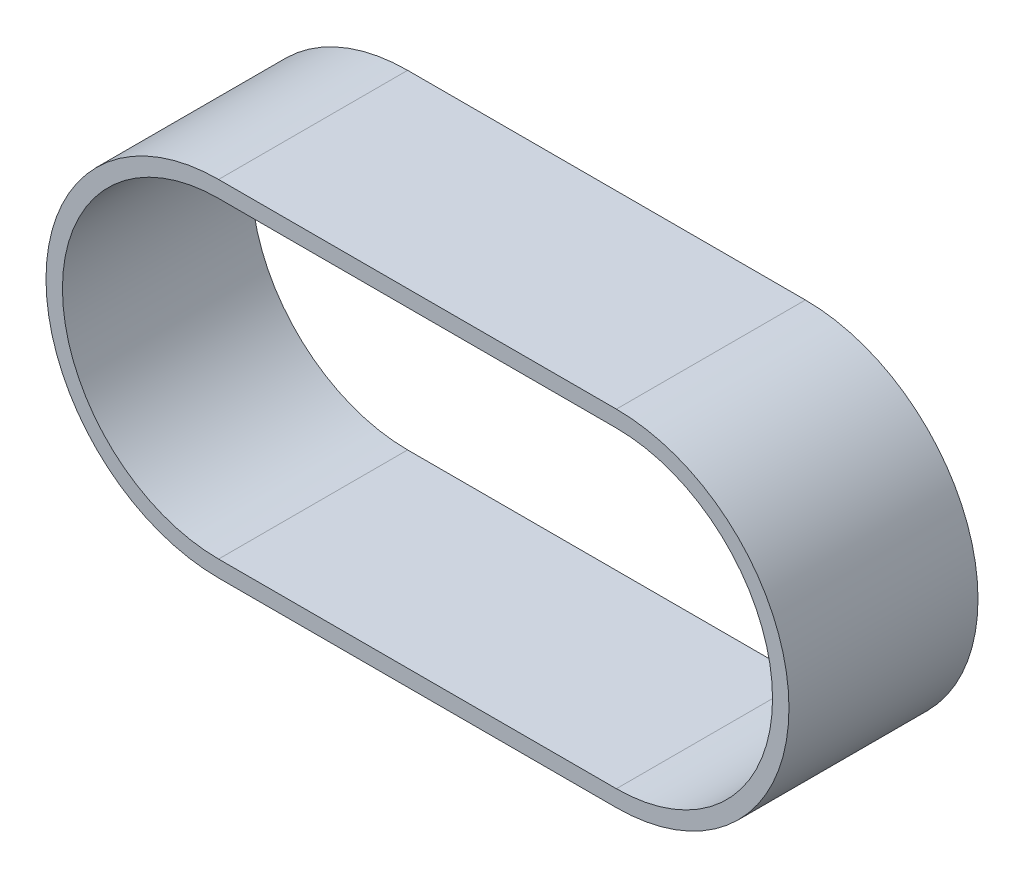
ISO-10303-21;
HEADER;
FILE_DESCRIPTION(('STEP AP214'),'2;1');
FILE_NAME('part.step','',(''),(''),'','','');
FILE_SCHEMA(('AUTOMOTIVE_DESIGN { 1 0 10303 214 1 1 1 1 }'));
ENDSEC;
DATA;
#1=APPLICATION_CONTEXT('core data for automotive mechanical design processes');
#2=APPLICATION_PROTOCOL_DEFINITION('international standard','automotive_design',2000,#1);
#3=PRODUCT_CONTEXT('',#1,'mechanical');
#4=PRODUCT('Part','Part','',(#3));
#5=PRODUCT_RELATED_PRODUCT_CATEGORY('part','',(#4));
#6=PRODUCT_DEFINITION_FORMATION('','',#4);
#7=PRODUCT_DEFINITION_CONTEXT('part definition',#1,'design');
#8=PRODUCT_DEFINITION('design','',#6,#7);
#9=PRODUCT_DEFINITION_SHAPE('','',#8);
#10=(LENGTH_UNIT() NAMED_UNIT(*) SI_UNIT(.MILLI.,.METRE.));
#11=(NAMED_UNIT(*) PLANE_ANGLE_UNIT() SI_UNIT($,.RADIAN.));
#12=(NAMED_UNIT(*) SI_UNIT($,.STERADIAN.) SOLID_ANGLE_UNIT());
#13=UNCERTAINTY_MEASURE_WITH_UNIT(LENGTH_MEASURE(1.E-05),#10,'distance_accuracy_value','');
#14=(GEOMETRIC_REPRESENTATION_CONTEXT(3) GLOBAL_UNCERTAINTY_ASSIGNED_CONTEXT((#13)) GLOBAL_UNIT_ASSIGNED_CONTEXT((#10,
#11,#12)) REPRESENTATION_CONTEXT('',''));
#15=CARTESIAN_POINT('',(0.,0.,0.));
#16=DIRECTION('',(0.,0.,1.));
#17=DIRECTION('',(1.,0.,0.));
#18=AXIS2_PLACEMENT_3D('',#15,#16,#17);
#19=CARTESIAN_POINT('',(-121.,0.,115.));
#20=DIRECTION('',(0.,0.,1.));
#21=DIRECTION('',(1.,0.,0.));
#22=AXIS2_PLACEMENT_3D('',#19,#20,#21);
#23=PLANE('',#22);
#24=CARTESIAN_POINT('',(-121.,0.,115.));
#25=DIRECTION('',(0.,0.,1.));
#26=DIRECTION('',(1.,0.,0.));
#27=AXIS2_PLACEMENT_3D('',#24,#25,#26);
#28=CIRCLE('',#27,105.);
#29=CARTESIAN_POINT('',(-121.,105.,115.));
#30=VERTEX_POINT('',#29);
#31=CARTESIAN_POINT('',(-121.,-105.,115.));
#32=VERTEX_POINT('',#31);
#33=EDGE_CURVE('E139',#30,#32,#28,.T.);
#34=ORIENTED_EDGE('',*,*,#33,.T.);
#35=DIRECTION('',(1.,0.,0.));
#36=VECTOR('',#35,1.);
#37=CARTESIAN_POINT('',(-121.,-105.,115.));
#38=LINE('',#37,#36);
#39=CARTESIAN_POINT('',(121.,-105.,115.));
#40=VERTEX_POINT('',#39);
#41=EDGE_CURVE('E142',#32,#40,#38,.T.);
#42=ORIENTED_EDGE('',*,*,#41,.T.);
#43=CARTESIAN_POINT('',(121.,0.,115.));
#44=DIRECTION('',(0.,0.,1.));
#45=DIRECTION('',(1.,0.,0.));
#46=AXIS2_PLACEMENT_3D('',#43,#44,#45);
#47=CIRCLE('',#46,105.);
#48=CARTESIAN_POINT('',(121.,105.,115.));
#49=VERTEX_POINT('',#48);
#50=EDGE_CURVE('E145',#40,#49,#47,.T.);
#51=ORIENTED_EDGE('',*,*,#50,.T.);
#52=DIRECTION('',(-1.,0.,0.));
#53=VECTOR('',#52,1.);
#54=CARTESIAN_POINT('',(-121.,105.,115.));
#55=LINE('',#54,#53);
#56=EDGE_CURVE('E147',#49,#30,#55,.T.);
#57=ORIENTED_EDGE('',*,*,#56,.T.);
#58=EDGE_LOOP('',(#34,#42,#51,#57));
#59=FACE_BOUND('',#58,.T.);
#60=DIRECTION('',(1.,0.,0.));
#61=VECTOR('',#60,1.);
#62=CARTESIAN_POINT('',(-121.,-95.,115.));
#63=LINE('',#62,#61);
#64=CARTESIAN_POINT('',(-121.,-95.,115.));
#65=VERTEX_POINT('',#64);
#66=CARTESIAN_POINT('',(121.,-95.,115.));
#67=VERTEX_POINT('',#66);
#68=EDGE_CURVE('E111',#65,#67,#63,.T.);
#69=ORIENTED_EDGE('',*,*,#68,.F.);
#70=CARTESIAN_POINT('',(-121.,0.,115.));
#71=DIRECTION('',(0.,0.,1.));
#72=DIRECTION('',(1.,0.,0.));
#73=AXIS2_PLACEMENT_3D('',#70,#71,#72);
#74=CIRCLE('',#73,95.);
#75=CARTESIAN_POINT('',(-121.,95.,115.));
#76=VERTEX_POINT('',#75);
#77=EDGE_CURVE('E103',#76,#65,#74,.T.);
#78=ORIENTED_EDGE('',*,*,#77,.F.);
#79=DIRECTION('',(-1.,0.,0.));
#80=VECTOR('',#79,1.);
#81=CARTESIAN_POINT('',(-121.,95.,115.));
#82=LINE('',#81,#80);
#83=CARTESIAN_POINT('',(121.,95.0000000000001,115.));
#84=VERTEX_POINT('',#83);
#85=EDGE_CURVE('E125',#84,#76,#82,.T.);
#86=ORIENTED_EDGE('',*,*,#85,.F.);
#87=CARTESIAN_POINT('',(121.,0.,115.));
#88=DIRECTION('',(0.,0.,1.));
#89=DIRECTION('',(1.,0.,0.));
#90=AXIS2_PLACEMENT_3D('',#87,#88,#89);
#91=CIRCLE('',#90,95.);
#92=EDGE_CURVE('E123',#67,#84,#91,.T.);
#93=ORIENTED_EDGE('',*,*,#92,.F.);
#94=EDGE_LOOP('',(#69,#78,#86,#93));
#95=FACE_BOUND('',#94,.T.);
#96=ADVANCED_FACE('F38',(#59,#95),#23,.T.);
#97=CARTESIAN_POINT('',(-121.,0.,0.));
#98=DIRECTION('',(0.,0.,1.));
#99=DIRECTION('',(1.,0.,0.));
#100=AXIS2_PLACEMENT_3D('',#97,#98,#99);
#101=PLANE('',#100);
#102=CARTESIAN_POINT('',(-121.,0.,0.));
#103=DIRECTION('',(0.,0.,1.));
#104=DIRECTION('',(1.,0.,0.));
#105=AXIS2_PLACEMENT_3D('',#102,#103,#104);
#106=CIRCLE('',#105,105.);
#107=CARTESIAN_POINT('',(-121.,105.,0.));
#108=VERTEX_POINT('',#107);
#109=CARTESIAN_POINT('',(-121.,-105.,0.));
#110=VERTEX_POINT('',#109);
#111=EDGE_CURVE('E119',#108,#110,#106,.T.);
#112=ORIENTED_EDGE('',*,*,#111,.F.);
#113=DIRECTION('',(-1.,0.,0.));
#114=VECTOR('',#113,1.);
#115=CARTESIAN_POINT('',(-121.,105.,0.));
#116=LINE('',#115,#114);
#117=CARTESIAN_POINT('',(121.,105.,0.));
#118=VERTEX_POINT('',#117);
#119=EDGE_CURVE('E143',#118,#108,#116,.T.);
#120=ORIENTED_EDGE('',*,*,#119,.F.);
#121=CARTESIAN_POINT('',(121.,0.,0.));
#122=DIRECTION('',(0.,0.,1.));
#123=DIRECTION('',(1.,0.,0.));
#124=AXIS2_PLACEMENT_3D('',#121,#122,#123);
#125=CIRCLE('',#124,105.);
#126=CARTESIAN_POINT('',(121.,-105.,0.));
#127=VERTEX_POINT('',#126);
#128=EDGE_CURVE('E154',#127,#118,#125,.T.);
#129=ORIENTED_EDGE('',*,*,#128,.F.);
#130=DIRECTION('',(1.,0.,0.));
#131=VECTOR('',#130,1.);
#132=CARTESIAN_POINT('',(-121.,-105.,0.));
#133=LINE('',#132,#131);
#134=EDGE_CURVE('E152',#110,#127,#133,.T.);
#135=ORIENTED_EDGE('',*,*,#134,.F.);
#136=EDGE_LOOP('',(#112,#120,#129,#135));
#137=FACE_BOUND('',#136,.T.);
#138=CARTESIAN_POINT('',(-121.,0.,0.));
#139=DIRECTION('',(0.,0.,1.));
#140=DIRECTION('',(1.,0.,0.));
#141=AXIS2_PLACEMENT_3D('',#138,#139,#140);
#142=CIRCLE('',#141,95.);
#143=CARTESIAN_POINT('',(-121.,95.,0.));
#144=VERTEX_POINT('',#143);
#145=CARTESIAN_POINT('',(-121.,-95.,0.));
#146=VERTEX_POINT('',#145);
#147=EDGE_CURVE('E61',#144,#146,#142,.T.);
#148=ORIENTED_EDGE('',*,*,#147,.T.);
#149=DIRECTION('',(1.,0.,0.));
#150=VECTOR('',#149,1.);
#151=CARTESIAN_POINT('',(-121.,-95.,0.));
#152=LINE('',#151,#150);
#153=CARTESIAN_POINT('',(121.,-95.,0.));
#154=VERTEX_POINT('',#153);
#155=EDGE_CURVE('E118',#146,#154,#152,.T.);
#156=ORIENTED_EDGE('',*,*,#155,.T.);
#157=CARTESIAN_POINT('',(121.,0.,0.));
#158=DIRECTION('',(0.,0.,1.));
#159=DIRECTION('',(1.,0.,0.));
#160=AXIS2_PLACEMENT_3D('',#157,#158,#159);
#161=CIRCLE('',#160,95.);
#162=CARTESIAN_POINT('',(121.,95.0000000000001,0.));
#163=VERTEX_POINT('',#162);
#164=EDGE_CURVE('E131',#154,#163,#161,.T.);
#165=ORIENTED_EDGE('',*,*,#164,.T.);
#166=DIRECTION('',(-1.,0.,0.));
#167=VECTOR('',#166,1.);
#168=CARTESIAN_POINT('',(-121.,95.,0.));
#169=LINE('',#168,#167);
#170=EDGE_CURVE('E112',#163,#144,#169,.T.);
#171=ORIENTED_EDGE('',*,*,#170,.T.);
#172=EDGE_LOOP('',(#148,#156,#165,#171));
#173=FACE_BOUND('',#172,.T.);
#174=ADVANCED_FACE('F172',(#137,#173),#101,.F.);
#175=CARTESIAN_POINT('',(-121.,0.,115.));
#176=DIRECTION('',(0.,0.,-1.));
#177=DIRECTION('',(-1.,0.,0.));
#178=AXIS2_PLACEMENT_3D('',#175,#176,#177);
#179=CYLINDRICAL_SURFACE('',#178,105.);
#180=ORIENTED_EDGE('',*,*,#111,.T.);
#181=DIRECTION('',(0.,0.,-1.));
#182=VECTOR('',#181,1.);
#183=CARTESIAN_POINT('',(-121.,-105.,115.));
#184=LINE('',#183,#182);
#185=EDGE_CURVE('E11',#32,#110,#184,.T.);
#186=ORIENTED_EDGE('',*,*,#185,.F.);
#187=ORIENTED_EDGE('',*,*,#33,.F.);
#188=DIRECTION('',(0.,0.,-1.));
#189=VECTOR('',#188,1.);
#190=CARTESIAN_POINT('',(-121.,105.,115.));
#191=LINE('',#190,#189);
#192=EDGE_CURVE('E149',#30,#108,#191,.T.);
#193=ORIENTED_EDGE('',*,*,#192,.T.);
#194=EDGE_LOOP('',(#180,#186,#187,#193));
#195=FACE_BOUND('',#194,.T.);
#196=ADVANCED_FACE('F40',(#195),#179,.T.);
#197=CARTESIAN_POINT('',(-121.,-105.,115.));
#198=DIRECTION('',(0.,1.,0.));
#199=DIRECTION('',(-1.,0.,0.));
#200=AXIS2_PLACEMENT_3D('',#197,#198,#199);
#201=PLANE('',#200);
#202=ORIENTED_EDGE('',*,*,#134,.T.);
#203=DIRECTION('',(0.,0.,-1.));
#204=VECTOR('',#203,1.);
#205=CARTESIAN_POINT('',(121.,-105.,115.));
#206=LINE('',#205,#204);
#207=EDGE_CURVE('E46',#40,#127,#206,.T.);
#208=ORIENTED_EDGE('',*,*,#207,.F.);
#209=ORIENTED_EDGE('',*,*,#41,.F.);
#210=ORIENTED_EDGE('',*,*,#185,.T.);
#211=EDGE_LOOP('',(#202,#208,#209,#210));
#212=FACE_BOUND('',#211,.T.);
#213=ADVANCED_FACE('F182',(#212),#201,.F.);
#214=CARTESIAN_POINT('',(121.,0.,115.));
#215=DIRECTION('',(0.,0.,-1.));
#216=DIRECTION('',(-1.,0.,0.));
#217=AXIS2_PLACEMENT_3D('',#214,#215,#216);
#218=CYLINDRICAL_SURFACE('',#217,105.);
#219=ORIENTED_EDGE('',*,*,#128,.T.);
#220=DIRECTION('',(0.,0.,-1.));
#221=VECTOR('',#220,1.);
#222=CARTESIAN_POINT('',(121.,105.,115.));
#223=LINE('',#222,#221);
#224=EDGE_CURVE('E159',#49,#118,#223,.T.);
#225=ORIENTED_EDGE('',*,*,#224,.F.);
#226=ORIENTED_EDGE('',*,*,#50,.F.);
#227=ORIENTED_EDGE('',*,*,#207,.T.);
#228=EDGE_LOOP('',(#219,#225,#226,#227));
#229=FACE_BOUND('',#228,.T.);
#230=ADVANCED_FACE('F166',(#229),#218,.T.);
#231=CARTESIAN_POINT('',(-121.,105.,115.));
#232=DIRECTION('',(0.,-1.,0.));
#233=DIRECTION('',(1.,0.,0.));
#234=AXIS2_PLACEMENT_3D('',#231,#232,#233);
#235=PLANE('',#234);
#236=ORIENTED_EDGE('',*,*,#119,.T.);
#237=ORIENTED_EDGE('',*,*,#192,.F.);
#238=ORIENTED_EDGE('',*,*,#56,.F.);
#239=ORIENTED_EDGE('',*,*,#224,.T.);
#240=EDGE_LOOP('',(#236,#237,#238,#239));
#241=FACE_BOUND('',#240,.T.);
#242=ADVANCED_FACE('F176',(#241),#235,.F.);
#243=CARTESIAN_POINT('',(-121.,0.,115.));
#244=DIRECTION('',(0.,0.,-1.));
#245=DIRECTION('',(-1.,0.,0.));
#246=AXIS2_PLACEMENT_3D('',#243,#244,#245);
#247=CYLINDRICAL_SURFACE('',#246,95.);
#248=ORIENTED_EDGE('',*,*,#147,.F.);
#249=DIRECTION('',(0.,0.,-1.));
#250=VECTOR('',#249,1.);
#251=CARTESIAN_POINT('',(-121.,95.,115.));
#252=LINE('',#251,#250);
#253=EDGE_CURVE('E107',#76,#144,#252,.T.);
#254=ORIENTED_EDGE('',*,*,#253,.F.);
#255=ORIENTED_EDGE('',*,*,#77,.T.);
#256=DIRECTION('',(0.,0.,-1.));
#257=VECTOR('',#256,1.);
#258=CARTESIAN_POINT('',(-121.,-95.,115.));
#259=LINE('',#258,#257);
#260=EDGE_CURVE('E106',#65,#146,#259,.T.);
#261=ORIENTED_EDGE('',*,*,#260,.T.);
#262=EDGE_LOOP('',(#248,#254,#255,#261));
#263=FACE_BOUND('',#262,.T.);
#264=ADVANCED_FACE('F105',(#263),#247,.F.);
#265=CARTESIAN_POINT('',(-121.,-95.,115.));
#266=DIRECTION('',(0.,1.,0.));
#267=DIRECTION('',(-1.,0.,0.));
#268=AXIS2_PLACEMENT_3D('',#265,#266,#267);
#269=PLANE('',#268);
#270=ORIENTED_EDGE('',*,*,#155,.F.);
#271=ORIENTED_EDGE('',*,*,#260,.F.);
#272=ORIENTED_EDGE('',*,*,#68,.T.);
#273=DIRECTION('',(0.,0.,-1.));
#274=VECTOR('',#273,1.);
#275=CARTESIAN_POINT('',(121.,-95.,115.));
#276=LINE('',#275,#274);
#277=EDGE_CURVE('E120',#67,#154,#276,.T.);
#278=ORIENTED_EDGE('',*,*,#277,.T.);
#279=EDGE_LOOP('',(#270,#271,#272,#278));
#280=FACE_BOUND('',#279,.T.);
#281=ADVANCED_FACE('F115',(#280),#269,.T.);
#282=CARTESIAN_POINT('',(121.,0.,115.));
#283=DIRECTION('',(0.,0.,-1.));
#284=DIRECTION('',(-1.,0.,0.));
#285=AXIS2_PLACEMENT_3D('',#282,#283,#284);
#286=CYLINDRICAL_SURFACE('',#285,95.);
#287=ORIENTED_EDGE('',*,*,#164,.F.);
#288=ORIENTED_EDGE('',*,*,#277,.F.);
#289=ORIENTED_EDGE('',*,*,#92,.T.);
#290=DIRECTION('',(0.,0.,-1.));
#291=VECTOR('',#290,1.);
#292=CARTESIAN_POINT('',(121.,95.0000000000001,115.));
#293=LINE('',#292,#291);
#294=EDGE_CURVE('E53',#84,#163,#293,.T.);
#295=ORIENTED_EDGE('',*,*,#294,.T.);
#296=EDGE_LOOP('',(#287,#288,#289,#295));
#297=FACE_BOUND('',#296,.T.);
#298=ADVANCED_FACE('F205',(#297),#286,.F.);
#299=CARTESIAN_POINT('',(-121.,95.,115.));
#300=DIRECTION('',(0.,-1.,0.));
#301=DIRECTION('',(1.,0.,0.));
#302=AXIS2_PLACEMENT_3D('',#299,#300,#301);
#303=PLANE('',#302);
#304=ORIENTED_EDGE('',*,*,#170,.F.);
#305=ORIENTED_EDGE('',*,*,#294,.F.);
#306=ORIENTED_EDGE('',*,*,#85,.T.);
#307=ORIENTED_EDGE('',*,*,#253,.T.);
#308=EDGE_LOOP('',(#304,#305,#306,#307));
#309=FACE_BOUND('',#308,.T.);
#310=ADVANCED_FACE('F209',(#309),#303,.T.);
#311=CLOSED_SHELL('',(#96,#174,#196,#213,#230,#242,#264,#281,#298,#310));
#312=MANIFOLD_SOLID_BREP('B2',#311);
#313=ADVANCED_BREP_SHAPE_REPRESENTATION('',(#18,#312),#14);
#314=SHAPE_DEFINITION_REPRESENTATION(#9,#313);
ENDSEC;
END-ISO-10303-21;
